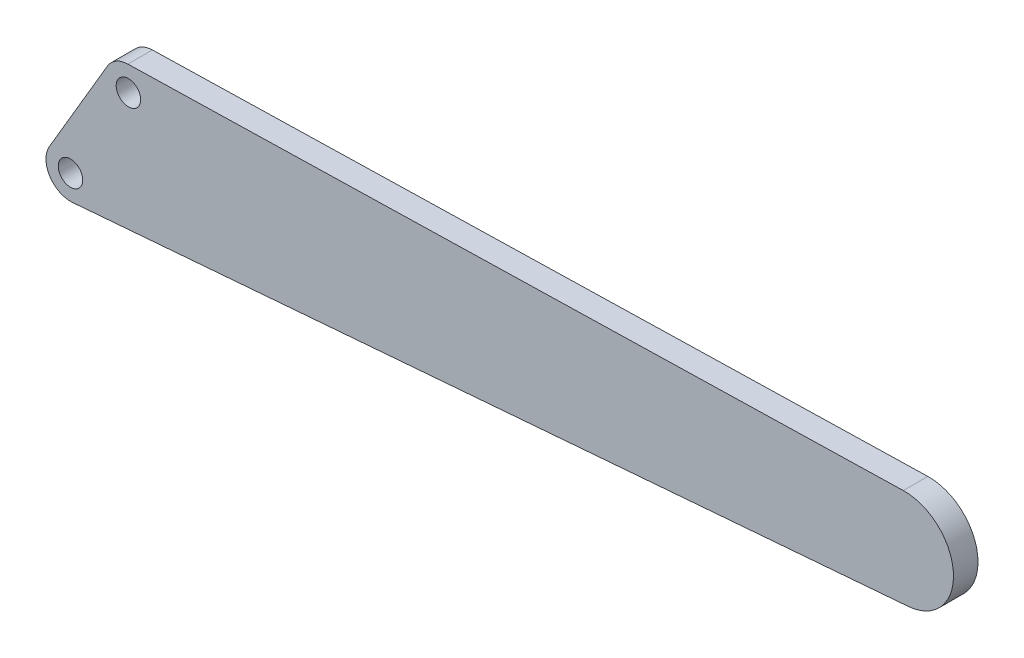
ISO-10303-21;
HEADER;
FILE_DESCRIPTION(('STEP AP214'),'2;1');
FILE_NAME('part.step','',(''),(''),'','','');
FILE_SCHEMA(('AUTOMOTIVE_DESIGN { 1 0 10303 214 1 1 1 1 }'));
ENDSEC;
DATA;
#1=APPLICATION_CONTEXT('core data for automotive mechanical design processes');
#2=APPLICATION_PROTOCOL_DEFINITION('international standard','automotive_design',2000,#1);
#3=PRODUCT_CONTEXT('',#1,'mechanical');
#4=PRODUCT('Part','Part','',(#3));
#5=PRODUCT_RELATED_PRODUCT_CATEGORY('part','',(#4));
#6=PRODUCT_DEFINITION_FORMATION('','',#4);
#7=PRODUCT_DEFINITION_CONTEXT('part definition',#1,'design');
#8=PRODUCT_DEFINITION('design','',#6,#7);
#9=PRODUCT_DEFINITION_SHAPE('','',#8);
#10=(LENGTH_UNIT() NAMED_UNIT(*) SI_UNIT(.MILLI.,.METRE.));
#11=(NAMED_UNIT(*) PLANE_ANGLE_UNIT() SI_UNIT($,.RADIAN.));
#12=(NAMED_UNIT(*) SI_UNIT($,.STERADIAN.) SOLID_ANGLE_UNIT());
#13=UNCERTAINTY_MEASURE_WITH_UNIT(LENGTH_MEASURE(1.E-05),#10,'distance_accuracy_value','');
#14=(GEOMETRIC_REPRESENTATION_CONTEXT(3) GLOBAL_UNCERTAINTY_ASSIGNED_CONTEXT((#13)) GLOBAL_UNIT_ASSIGNED_CONTEXT((#10,
#11,#12)) REPRESENTATION_CONTEXT('',''));
#15=CARTESIAN_POINT('',(0.,0.,0.));
#16=DIRECTION('',(0.,0.,1.));
#17=DIRECTION('',(1.,0.,0.));
#18=AXIS2_PLACEMENT_3D('',#15,#16,#17);
#19=CARTESIAN_POINT('',(0.,0.,3.));
#20=DIRECTION('',(0.,0.,1.));
#21=DIRECTION('',(1.,0.,0.));
#22=AXIS2_PLACEMENT_3D('',#19,#20,#21);
#23=PLANE('',#22);
#24=CARTESIAN_POINT('',(-7.09509018687296,-12.0689558471369,3.));
#25=DIRECTION('',(0.,0.,1.));
#26=DIRECTION('',(1.,0.,0.));
#27=AXIS2_PLACEMENT_3D('',#24,#25,#26);
#28=CIRCLE('',#27,1.5);
#29=CARTESIAN_POINT('',(-5.59509018687296,-12.0689558471369,3.));
#30=VERTEX_POINT('',#29);
#31=EDGE_CURVE('E125',#30,#30,#28,.T.);
#32=ORIENTED_EDGE('',*,*,#31,.F.);
#33=EDGE_LOOP('',(#32));
#34=FACE_BOUND('',#33,.T.);
#35=CARTESIAN_POINT('',(0.,0.,3.));
#36=DIRECTION('',(0.,0.,1.));
#37=DIRECTION('',(1.,0.,0.));
#38=AXIS2_PLACEMENT_3D('',#35,#36,#37);
#39=CIRCLE('',#38,3.);
#40=CARTESIAN_POINT('',(-0.0711605159086339,2.99915591141501,3.));
#41=VERTEX_POINT('',#40);
#42=CARTESIAN_POINT('',(-2.58620482438647,1.52037646861563,3.));
#43=VERTEX_POINT('',#42);
#44=EDGE_CURVE('E132',#41,#43,#39,.T.);
#45=ORIENTED_EDGE('',*,*,#44,.T.);
#46=DIRECTION('',(-0.506792156205212,-0.86206827479549,0.));
#47=VECTOR('',#46,1.);
#48=CARTESIAN_POINT('',(-9.68129501125943,-10.5485793785212,3.));
#49=LINE('',#48,#47);
#50=CARTESIAN_POINT('',(-9.68129501125943,-10.5485793785212,3.));
#51=VERTEX_POINT('',#50);
#52=EDGE_CURVE('E90',#43,#51,#49,.T.);
#53=ORIENTED_EDGE('',*,*,#52,.T.);
#54=CARTESIAN_POINT('',(-7.09509018687296,-12.0689558471369,3.));
#55=DIRECTION('',(0.,0.,1.));
#56=DIRECTION('',(1.,0.,0.));
#57=AXIS2_PLACEMENT_3D('',#54,#55,#56);
#58=CIRCLE('',#57,3.);
#59=CARTESIAN_POINT('',(-6.85164589837067,-15.0590620122079,3.));
#60=VERTEX_POINT('',#59);
#61=EDGE_CURVE('E103',#51,#60,#58,.T.);
#62=ORIENTED_EDGE('',*,*,#61,.T.);
#63=DIRECTION('',(0.996702055023667,0.0811480961674308,0.));
#64=VECTOR('',#63,1.);
#65=CARTESIAN_POINT('',(95.4868885770046,-6.7270061130711,3.));
#66=LINE('',#65,#64);
#67=CARTESIAN_POINT('',(95.4868885770046,-6.7270061130711,3.));
#68=VERTEX_POINT('',#67);
#69=EDGE_CURVE('E97',#60,#68,#66,.T.);
#70=ORIENTED_EDGE('',*,*,#69,.T.);
#71=CARTESIAN_POINT('',(95.,-0.746793782929099,3.));
#72=DIRECTION('',(0.,0.,1.));
#73=DIRECTION('',(1.,0.,0.));
#74=AXIS2_PLACEMENT_3D('',#71,#72,#73);
#75=CIRCLE('',#74,6.);
#76=CARTESIAN_POINT('',(94.8576789681827,5.25151803990093,3.));
#77=VERTEX_POINT('',#76);
#78=EDGE_CURVE('E101',#68,#77,#75,.T.);
#79=ORIENTED_EDGE('',*,*,#78,.T.);
#80=DIRECTION('',(-0.999718637138338,-0.0237201719695446,0.));
#81=VECTOR('',#80,1.);
#82=CARTESIAN_POINT('',(-0.0711605159086339,2.99915591141501,3.));
#83=LINE('',#82,#81);
#84=EDGE_CURVE('E53',#77,#41,#83,.T.);
#85=ORIENTED_EDGE('',*,*,#84,.T.);
#86=EDGE_LOOP('',(#45,#53,#62,#70,#79,#85));
#87=FACE_BOUND('',#86,.T.);
#88=CARTESIAN_POINT('',(0.,0.,3.));
#89=DIRECTION('',(0.,0.,1.));
#90=DIRECTION('',(1.,0.,0.));
#91=AXIS2_PLACEMENT_3D('',#88,#89,#90);
#92=CIRCLE('',#91,1.5);
#93=CARTESIAN_POINT('',(1.5,0.,3.));
#94=VERTEX_POINT('',#93);
#95=EDGE_CURVE('E174',#94,#94,#92,.T.);
#96=ORIENTED_EDGE('',*,*,#95,.F.);
#97=EDGE_LOOP('',(#96));
#98=FACE_BOUND('',#97,.T.);
#99=ADVANCED_FACE('F36',(#34,#87,#98),#23,.T.);
#100=CARTESIAN_POINT('',(0.,0.,0.));
#101=DIRECTION('',(0.,0.,1.));
#102=DIRECTION('',(1.,0.,0.));
#103=AXIS2_PLACEMENT_3D('',#100,#101,#102);
#104=PLANE('',#103);
#105=CARTESIAN_POINT('',(0.,0.,0.));
#106=DIRECTION('',(0.,0.,1.));
#107=DIRECTION('',(1.,0.,0.));
#108=AXIS2_PLACEMENT_3D('',#105,#106,#107);
#109=CIRCLE('',#108,3.);
#110=CARTESIAN_POINT('',(-0.0711605159086339,2.99915591141501,0.));
#111=VERTEX_POINT('',#110);
#112=CARTESIAN_POINT('',(-2.58620482438647,1.52037646861563,0.));
#113=VERTEX_POINT('',#112);
#114=EDGE_CURVE('E121',#111,#113,#109,.T.);
#115=ORIENTED_EDGE('',*,*,#114,.F.);
#116=DIRECTION('',(-0.999718637138338,-0.0237201719695446,0.));
#117=VECTOR('',#116,1.);
#118=CARTESIAN_POINT('',(-0.0711605159086339,2.99915591141501,0.));
#119=LINE('',#118,#117);
#120=CARTESIAN_POINT('',(94.8576789681827,5.25151803990093,0.));
#121=VERTEX_POINT('',#120);
#122=EDGE_CURVE('E82',#121,#111,#119,.T.);
#123=ORIENTED_EDGE('',*,*,#122,.F.);
#124=CARTESIAN_POINT('',(95.,-0.746793782929099,0.));
#125=DIRECTION('',(0.,0.,1.));
#126=DIRECTION('',(1.,0.,0.));
#127=AXIS2_PLACEMENT_3D('',#124,#125,#126);
#128=CIRCLE('',#127,6.);
#129=CARTESIAN_POINT('',(95.4868885770046,-6.7270061130711,0.));
#130=VERTEX_POINT('',#129);
#131=EDGE_CURVE('E76',#130,#121,#128,.T.);
#132=ORIENTED_EDGE('',*,*,#131,.F.);
#133=DIRECTION('',(0.996702055023667,0.0811480961674308,0.));
#134=VECTOR('',#133,1.);
#135=CARTESIAN_POINT('',(95.4868885770046,-6.7270061130711,0.));
#136=LINE('',#135,#134);
#137=CARTESIAN_POINT('',(-6.85164589837067,-15.0590620122079,0.));
#138=VERTEX_POINT('',#137);
#139=EDGE_CURVE('E111',#138,#130,#136,.T.);
#140=ORIENTED_EDGE('',*,*,#139,.F.);
#141=CARTESIAN_POINT('',(-7.09509018687296,-12.0689558471369,0.));
#142=DIRECTION('',(0.,0.,1.));
#143=DIRECTION('',(1.,0.,0.));
#144=AXIS2_PLACEMENT_3D('',#141,#142,#143);
#145=CIRCLE('',#144,3.);
#146=CARTESIAN_POINT('',(-9.68129501125943,-10.5485793785212,0.));
#147=VERTEX_POINT('',#146);
#148=EDGE_CURVE('E127',#147,#138,#145,.T.);
#149=ORIENTED_EDGE('',*,*,#148,.F.);
#150=DIRECTION('',(-0.506792156205212,-0.86206827479549,0.));
#151=VECTOR('',#150,1.);
#152=CARTESIAN_POINT('',(-9.68129501125943,-10.5485793785212,0.));
#153=LINE('',#152,#151);
#154=EDGE_CURVE('E124',#113,#147,#153,.T.);
#155=ORIENTED_EDGE('',*,*,#154,.F.);
#156=EDGE_LOOP('',(#115,#123,#132,#140,#149,#155));
#157=FACE_BOUND('',#156,.T.);
#158=CARTESIAN_POINT('',(-7.09509018687296,-12.0689558471369,0.));
#159=DIRECTION('',(0.,0.,1.));
#160=DIRECTION('',(1.,0.,0.));
#161=AXIS2_PLACEMENT_3D('',#158,#159,#160);
#162=CIRCLE('',#161,1.5);
#163=CARTESIAN_POINT('',(-5.59509018687296,-12.0689558471369,0.));
#164=VERTEX_POINT('',#163);
#165=EDGE_CURVE('E180',#164,#164,#162,.T.);
#166=ORIENTED_EDGE('',*,*,#165,.T.);
#167=EDGE_LOOP('',(#166));
#168=FACE_BOUND('',#167,.T.);
#169=CARTESIAN_POINT('',(0.,0.,0.));
#170=DIRECTION('',(0.,0.,1.));
#171=DIRECTION('',(1.,0.,0.));
#172=AXIS2_PLACEMENT_3D('',#169,#170,#171);
#173=CIRCLE('',#172,1.5);
#174=CARTESIAN_POINT('',(1.5,0.,0.));
#175=VERTEX_POINT('',#174);
#176=EDGE_CURVE('E177',#175,#175,#173,.T.);
#177=ORIENTED_EDGE('',*,*,#176,.T.);
#178=EDGE_LOOP('',(#177));
#179=FACE_BOUND('',#178,.T.);
#180=ADVANCED_FACE('F141',(#157,#168,#179),#104,.F.);
#181=CARTESIAN_POINT('',(0.,0.,3.));
#182=DIRECTION('',(0.,0.,-1.));
#183=DIRECTION('',(-1.,0.,0.));
#184=AXIS2_PLACEMENT_3D('',#181,#182,#183);
#185=CYLINDRICAL_SURFACE('',#184,3.);
#186=ORIENTED_EDGE('',*,*,#114,.T.);
#187=DIRECTION('',(0.,0.,-1.));
#188=VECTOR('',#187,1.);
#189=CARTESIAN_POINT('',(-2.58620482438647,1.52037646861563,3.));
#190=LINE('',#189,#188);
#191=EDGE_CURVE('E11',#43,#113,#190,.T.);
#192=ORIENTED_EDGE('',*,*,#191,.F.);
#193=ORIENTED_EDGE('',*,*,#44,.F.);
#194=DIRECTION('',(0.,0.,-1.));
#195=VECTOR('',#194,1.);
#196=CARTESIAN_POINT('',(-0.0711605159086339,2.99915591141501,3.));
#197=LINE('',#196,#195);
#198=EDGE_CURVE('E117',#41,#111,#197,.T.);
#199=ORIENTED_EDGE('',*,*,#198,.T.);
#200=EDGE_LOOP('',(#186,#192,#193,#199));
#201=FACE_BOUND('',#200,.T.);
#202=ADVANCED_FACE('F38',(#201),#185,.T.);
#203=CARTESIAN_POINT('',(-9.68129501125943,-10.5485793785212,3.));
#204=DIRECTION('',(0.86206827479549,-0.506792156205212,0.));
#205=DIRECTION('',(0.506792156205212,0.86206827479549,0.));
#206=AXIS2_PLACEMENT_3D('',#203,#204,#205);
#207=PLANE('',#206);
#208=ORIENTED_EDGE('',*,*,#154,.T.);
#209=DIRECTION('',(0.,0.,-1.));
#210=VECTOR('',#209,1.);
#211=CARTESIAN_POINT('',(-9.68129501125943,-10.5485793785212,3.));
#212=LINE('',#211,#210);
#213=EDGE_CURVE('E45',#51,#147,#212,.T.);
#214=ORIENTED_EDGE('',*,*,#213,.F.);
#215=ORIENTED_EDGE('',*,*,#52,.F.);
#216=ORIENTED_EDGE('',*,*,#191,.T.);
#217=EDGE_LOOP('',(#208,#214,#215,#216));
#218=FACE_BOUND('',#217,.T.);
#219=ADVANCED_FACE('F221',(#218),#207,.F.);
#220=CARTESIAN_POINT('',(-7.09509018687296,-12.0689558471369,3.));
#221=DIRECTION('',(0.,0.,-1.));
#222=DIRECTION('',(-1.,0.,0.));
#223=AXIS2_PLACEMENT_3D('',#220,#221,#222);
#224=CYLINDRICAL_SURFACE('',#223,3.);
#225=ORIENTED_EDGE('',*,*,#148,.T.);
#226=DIRECTION('',(0.,0.,-1.));
#227=VECTOR('',#226,1.);
#228=CARTESIAN_POINT('',(-6.85164589837067,-15.0590620122079,3.));
#229=LINE('',#228,#227);
#230=EDGE_CURVE('E112',#60,#138,#229,.T.);
#231=ORIENTED_EDGE('',*,*,#230,.F.);
#232=ORIENTED_EDGE('',*,*,#61,.F.);
#233=ORIENTED_EDGE('',*,*,#213,.T.);
#234=EDGE_LOOP('',(#225,#231,#232,#233));
#235=FACE_BOUND('',#234,.T.);
#236=ADVANCED_FACE('F138',(#235),#224,.T.);
#237=CARTESIAN_POINT('',(95.4868885770046,-6.7270061130711,3.));
#238=DIRECTION('',(-0.0811480961674308,0.996702055023667,0.));
#239=DIRECTION('',(-0.996702055023667,-0.0811480961674308,0.));
#240=AXIS2_PLACEMENT_3D('',#237,#238,#239);
#241=PLANE('',#240);
#242=ORIENTED_EDGE('',*,*,#139,.T.);
#243=DIRECTION('',(0.,0.,-1.));
#244=VECTOR('',#243,1.);
#245=CARTESIAN_POINT('',(95.4868885770046,-6.7270061130711,3.));
#246=LINE('',#245,#244);
#247=EDGE_CURVE('E108',#68,#130,#246,.T.);
#248=ORIENTED_EDGE('',*,*,#247,.F.);
#249=ORIENTED_EDGE('',*,*,#69,.F.);
#250=ORIENTED_EDGE('',*,*,#230,.T.);
#251=EDGE_LOOP('',(#242,#248,#249,#250));
#252=FACE_BOUND('',#251,.T.);
#253=ADVANCED_FACE('F109',(#252),#241,.F.);
#254=CARTESIAN_POINT('',(95.,-0.746793782929099,3.));
#255=DIRECTION('',(0.,0.,-1.));
#256=DIRECTION('',(-1.,0.,0.));
#257=AXIS2_PLACEMENT_3D('',#254,#255,#256);
#258=CYLINDRICAL_SURFACE('',#257,6.);
#259=ORIENTED_EDGE('',*,*,#131,.T.);
#260=DIRECTION('',(0.,0.,-1.));
#261=VECTOR('',#260,1.);
#262=CARTESIAN_POINT('',(94.8576789681827,5.25151803990093,3.));
#263=LINE('',#262,#261);
#264=EDGE_CURVE('E113',#77,#121,#263,.T.);
#265=ORIENTED_EDGE('',*,*,#264,.F.);
#266=ORIENTED_EDGE('',*,*,#78,.F.);
#267=ORIENTED_EDGE('',*,*,#247,.T.);
#268=EDGE_LOOP('',(#259,#265,#266,#267));
#269=FACE_BOUND('',#268,.T.);
#270=ADVANCED_FACE('F115',(#269),#258,.T.);
#271=CARTESIAN_POINT('',(-0.0711605159086339,2.99915591141501,3.));
#272=DIRECTION('',(0.0237201719695446,-0.999718637138338,0.));
#273=DIRECTION('',(0.999718637138338,0.0237201719695446,0.));
#274=AXIS2_PLACEMENT_3D('',#271,#272,#273);
#275=PLANE('',#274);
#276=ORIENTED_EDGE('',*,*,#122,.T.);
#277=ORIENTED_EDGE('',*,*,#198,.F.);
#278=ORIENTED_EDGE('',*,*,#84,.F.);
#279=ORIENTED_EDGE('',*,*,#264,.T.);
#280=EDGE_LOOP('',(#276,#277,#278,#279));
#281=FACE_BOUND('',#280,.T.);
#282=ADVANCED_FACE('F146',(#281),#275,.F.);
#283=CARTESIAN_POINT('',(-7.09509018687296,-12.0689558471369,3.));
#284=DIRECTION('',(0.,0.,-1.));
#285=DIRECTION('',(-1.,0.,0.));
#286=AXIS2_PLACEMENT_3D('',#283,#284,#285);
#287=CYLINDRICAL_SURFACE('',#286,1.5);
#288=ORIENTED_EDGE('',*,*,#31,.T.);
#289=EDGE_LOOP('',(#288));
#290=FACE_BOUND('',#289,.T.);
#291=ORIENTED_EDGE('',*,*,#165,.F.);
#292=EDGE_LOOP('',(#291));
#293=FACE_BOUND('',#292,.T.);
#294=ADVANCED_FACE('F148',(#290,#293),#287,.F.);
#295=CARTESIAN_POINT('',(0.,0.,3.));
#296=DIRECTION('',(0.,0.,-1.));
#297=DIRECTION('',(-1.,0.,0.));
#298=AXIS2_PLACEMENT_3D('',#295,#296,#297);
#299=CYLINDRICAL_SURFACE('',#298,1.5);
#300=ORIENTED_EDGE('',*,*,#95,.T.);
#301=EDGE_LOOP('',(#300));
#302=FACE_BOUND('',#301,.T.);
#303=ORIENTED_EDGE('',*,*,#176,.F.);
#304=EDGE_LOOP('',(#303));
#305=FACE_BOUND('',#304,.T.);
#306=ADVANCED_FACE('F154',(#302,#305),#299,.F.);
#307=CLOSED_SHELL('',(#99,#180,#202,#219,#236,#253,#270,#282,#294,#306));
#308=MANIFOLD_SOLID_BREP('B2',#307);
#309=ADVANCED_BREP_SHAPE_REPRESENTATION('',(#18,#308),#14);
#310=SHAPE_DEFINITION_REPRESENTATION(#9,#309);
ENDSEC;
END-ISO-10303-21;
